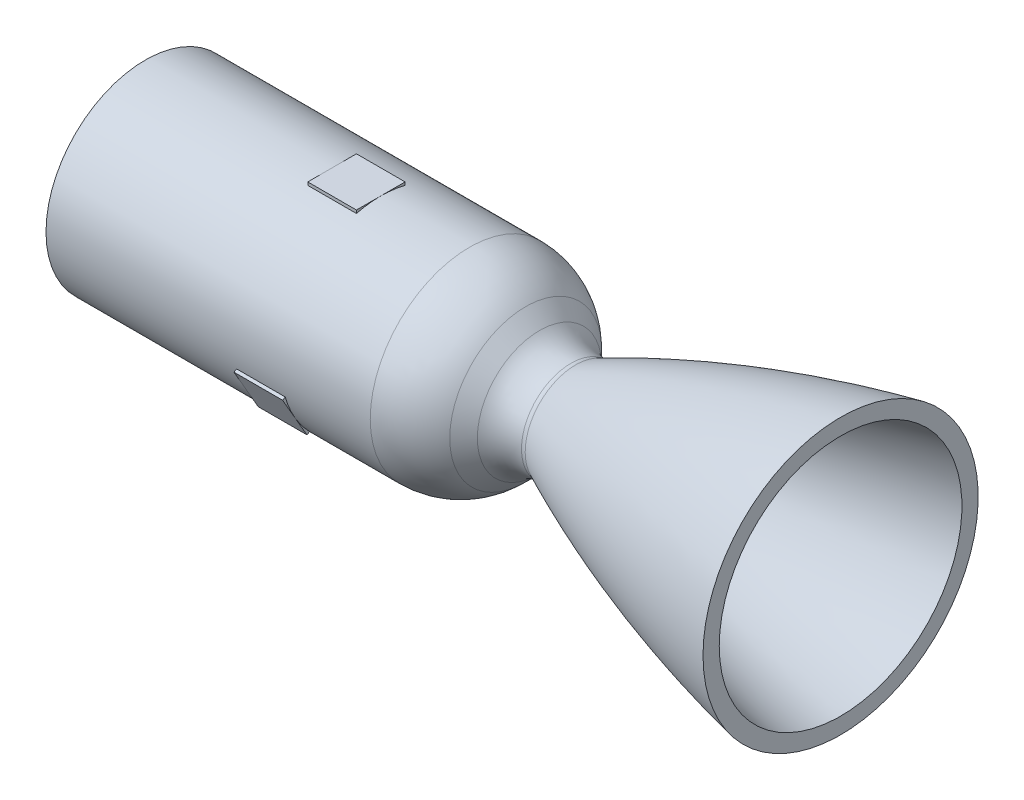
ISO-10303-21;
HEADER;
FILE_DESCRIPTION(('STEP AP214'),'2;1');
FILE_NAME('part.step','',(''),(''),'','','');
FILE_SCHEMA(('AUTOMOTIVE_DESIGN { 1 0 10303 214 1 1 1 1 }'));
ENDSEC;
DATA;
#1=APPLICATION_CONTEXT('core data for automotive mechanical design processes');
#2=APPLICATION_PROTOCOL_DEFINITION('international standard','automotive_design',2000,#1);
#3=PRODUCT_CONTEXT('',#1,'mechanical');
#4=PRODUCT('Part','Part','',(#3));
#5=PRODUCT_RELATED_PRODUCT_CATEGORY('part','',(#4));
#6=PRODUCT_DEFINITION_FORMATION('','',#4);
#7=PRODUCT_DEFINITION_CONTEXT('part definition',#1,'design');
#8=PRODUCT_DEFINITION('design','',#6,#7);
#9=PRODUCT_DEFINITION_SHAPE('','',#8);
#10=(LENGTH_UNIT() NAMED_UNIT(*) SI_UNIT(.MILLI.,.METRE.));
#11=(NAMED_UNIT(*) PLANE_ANGLE_UNIT() SI_UNIT($,.RADIAN.));
#12=(NAMED_UNIT(*) SI_UNIT($,.STERADIAN.) SOLID_ANGLE_UNIT());
#13=UNCERTAINTY_MEASURE_WITH_UNIT(LENGTH_MEASURE(1.E-05),#10,'distance_accuracy_value','');
#14=(GEOMETRIC_REPRESENTATION_CONTEXT(3) GLOBAL_UNCERTAINTY_ASSIGNED_CONTEXT((#13)) GLOBAL_UNIT_ASSIGNED_CONTEXT((#10,
#11,#12)) REPRESENTATION_CONTEXT('',''));
#15=CARTESIAN_POINT('',(0.,0.,0.));
#16=DIRECTION('',(0.,0.,1.));
#17=DIRECTION('',(1.,0.,0.));
#18=AXIS2_PLACEMENT_3D('',#15,#16,#17);
#19=CARTESIAN_POINT('',(-1.94875413684222,-13.3985,0.));
#20=DIRECTION('',(-1.,0.,0.));
#21=DIRECTION('',(0.,0.,1.));
#22=AXIS2_PLACEMENT_3D('',#19,#20,#21);
#23=TOROIDAL_SURFACE('',#22,30.2904023033658,17.30502);
#24=CARTESIAN_POINT('',(-1.86248370200098,-13.3985,0.));
#25=DIRECTION('',(-1.,0.,0.));
#26=DIRECTION('',(0.,0.,1.));
#27=AXIS2_PLACEMENT_3D('',#24,#25,#26);
#28=CIRCLE('',#27,12.985597346);
#29=CARTESIAN_POINT('',(-1.86248370200098,-13.3985,12.985597346));
#30=VERTEX_POINT('',#29);
#31=EDGE_CURVE('E308',#30,#30,#28,.T.);
#32=ORIENTED_EDGE('',*,*,#31,.F.);
#33=EDGE_LOOP('',(#32));
#34=FACE_BOUND('',#33,.T.);
#35=CARTESIAN_POINT('',(-14.1240966598112,-13.3985,0.));
#36=DIRECTION('',(-1.,0.,0.));
#37=DIRECTION('',(0.,0.,1.));
#38=AXIS2_PLACEMENT_3D('',#35,#36,#37);
#39=CIRCLE('',#38,17.9930549614069);
#40=CARTESIAN_POINT('',(-14.1240966598112,-13.3985,17.9930549614069));
#41=VERTEX_POINT('',#40);
#42=EDGE_CURVE('E11',#41,#41,#39,.T.);
#43=ORIENTED_EDGE('',*,*,#42,.T.);
#44=EDGE_LOOP('',(#43));
#45=FACE_BOUND('',#44,.T.);
#46=ADVANCED_FACE('F42',(#34,#45),#23,.T.);
#47=CARTESIAN_POINT('',(-19.5266187422485,-13.3985,0.));
#48=DIRECTION('',(-1.,0.,0.));
#49=DIRECTION('',(0.,0.,1.));
#50=AXIS2_PLACEMENT_3D('',#47,#48,#49);
#51=CONICAL_SURFACE('',#50,23.3955770438442,0.785398163397447);
#52=ORIENTED_EDGE('',*,*,#42,.F.);
#53=EDGE_LOOP('',(#52));
#54=FACE_BOUND('',#53,.T.);
#55=CARTESIAN_POINT('',(-19.5266187422485,-13.3985,0.));
#56=DIRECTION('',(-1.,0.,0.));
#57=DIRECTION('',(0.,0.,1.));
#58=AXIS2_PLACEMENT_3D('',#55,#56,#57);
#59=CIRCLE('',#58,23.3955770438442);
#60=CARTESIAN_POINT('',(-19.5266187422485,-13.3985,23.3955770438442));
#61=VERTEX_POINT('',#60);
#62=EDGE_CURVE('E49',#61,#61,#59,.T.);
#63=ORIENTED_EDGE('',*,*,#62,.T.);
#64=EDGE_LOOP('',(#63));
#65=FACE_BOUND('',#64,.T.);
#66=ADVANCED_FACE('F371',(#54,#65),#51,.F.);
#67=CARTESIAN_POINT('',(-41.5336343925406,-13.3985,0.));
#68=DIRECTION('',(-1.,0.,0.));
#69=DIRECTION('',(0.,0.,1.));
#70=AXIS2_PLACEMENT_3D('',#67,#68,#69);
#71=DEGENERATE_TOROIDAL_SURFACE('',#70,1.3885613935522,31.12262,.T.);
#72=ORIENTED_EDGE('',*,*,#62,.F.);
#73=EDGE_LOOP('',(#72));
#74=FACE_BOUND('',#73,.T.);
#75=CARTESIAN_POINT('',(-41.5336343925407,-13.3985,0.));
#76=DIRECTION('',(-1.,0.,0.));
#77=DIRECTION('',(0.,0.,1.));
#78=AXIS2_PLACEMENT_3D('',#75,#76,#77);
#79=CIRCLE('',#78,32.5111813935522);
#80=CARTESIAN_POINT('',(-41.5336343925407,-13.3985,32.5111813935522));
#81=VERTEX_POINT('',#80);
#82=EDGE_CURVE('E384',#81,#81,#79,.T.);
#83=ORIENTED_EDGE('',*,*,#82,.T.);
#84=EDGE_LOOP('',(#83));
#85=FACE_BOUND('',#84,.T.);
#86=ADVANCED_FACE('F368',(#74,#85),#71,.F.);
#87=CARTESIAN_POINT('',(-168.447274484,-13.3985,0.));
#88=DIRECTION('',(-1.,0.,0.));
#89=DIRECTION('',(0.,0.,1.));
#90=AXIS2_PLACEMENT_3D('',#87,#88,#89);
#91=CYLINDRICAL_SURFACE('',#90,32.5111813935522);
#92=ORIENTED_EDGE('',*,*,#82,.F.);
#93=EDGE_LOOP('',(#92));
#94=FACE_BOUND('',#93,.T.);
#95=CARTESIAN_POINT('',(-168.447274392541,-13.3985,0.));
#96=DIRECTION('',(-1.,0.,0.));
#97=DIRECTION('',(0.,0.,1.));
#98=AXIS2_PLACEMENT_3D('',#95,#96,#97);
#99=CIRCLE('',#98,32.5111813935522);
#100=CARTESIAN_POINT('',(-168.447274392541,-13.3985,32.5111813935522));
#101=VERTEX_POINT('',#100);
#102=EDGE_CURVE('E387',#101,#101,#99,.T.);
#103=ORIENTED_EDGE('',*,*,#102,.T.);
#104=EDGE_LOOP('',(#103));
#105=FACE_BOUND('',#104,.T.);
#106=ADVANCED_FACE('F364',(#94,#105),#91,.F.);
#107=CARTESIAN_POINT('',(-168.447274392541,25.4626813937186,0.));
#108=DIRECTION('',(1.,0.,0.));
#109=DIRECTION('',(0.,0.,-1.));
#110=AXIS2_PLACEMENT_3D('',#107,#108,#109);
#111=PLANE('',#110);
#112=ORIENTED_EDGE('',*,*,#102,.F.);
#113=EDGE_LOOP('',(#112));
#114=FACE_BOUND('',#113,.T.);
#115=CARTESIAN_POINT('',(-168.447274392541,-13.3985,0.));
#116=DIRECTION('',(-1.,0.,0.));
#117=DIRECTION('',(0.,0.,1.));
#118=AXIS2_PLACEMENT_3D('',#115,#116,#117);
#119=CIRCLE('',#118,38.8611813937186);
#120=CARTESIAN_POINT('',(-168.447274392541,-13.3985,38.8611813937186));
#121=VERTEX_POINT('',#120);
#122=EDGE_CURVE('E392',#121,#121,#119,.T.);
#123=ORIENTED_EDGE('',*,*,#122,.T.);
#124=EDGE_LOOP('',(#123));
#125=FACE_BOUND('',#124,.T.);
#126=ADVANCED_FACE('F361',(#114,#125),#111,.F.);
#127=CARTESIAN_POINT('',(-168.447274484,-13.3985,0.));
#128=DIRECTION('',(-1.,0.,0.));
#129=DIRECTION('',(0.,0.,1.));
#130=AXIS2_PLACEMENT_3D('',#127,#128,#129);
#131=CYLINDRICAL_SURFACE('',#130,38.8611813937186);
#132=DIRECTION('',(-1.,0.,0.));
#133=VECTOR('',#132,1.);
#134=CARTESIAN_POINT('',(-168.447274484,-23.9875072902279,37.3906986284424));
#135=LINE('',#134,#133);
#136=CARTESIAN_POINT('',(-76.2742871149733,-23.9875072902279,37.3906986284424));
#137=VERTEX_POINT('',#136);
#138=CARTESIAN_POINT('',(-95.3242871149733,-23.9875072902279,37.3906986284424));
#139=VERTEX_POINT('',#138);
#140=EDGE_CURVE('E58',#137,#139,#135,.T.);
#141=ORIENTED_EDGE('',*,*,#140,.F.);
#142=CARTESIAN_POINT('',(-76.2742871149733,-13.3985,0.));
#143=DIRECTION('',(1.,0.,0.));
#144=DIRECTION('',(0.,0.,-1.));
#145=AXIS2_PLACEMENT_3D('',#142,#143,#144);
#146=CIRCLE('',#145,38.8611813937186);
#147=CARTESIAN_POINT('',(-76.2742871149733,-32.829090696859,33.6547703080357));
#148=VERTEX_POINT('',#147);
#149=EDGE_CURVE('E181',#148,#137,#146,.F.);
#150=ORIENTED_EDGE('',*,*,#149,.F.);
#151=CARTESIAN_POINT('',(-76.2742871149733,-13.3985,0.));
#152=DIRECTION('',(1.,0.,0.));
#153=DIRECTION('',(0.,0.,-1.));
#154=AXIS2_PLACEMENT_3D('',#151,#152,#153);
#155=CIRCLE('',#154,38.8611813937186);
#156=CARTESIAN_POINT('',(-76.2742871149733,-40.4852912323226,27.8656986284585));
#157=VERTEX_POINT('',#156);
#158=EDGE_CURVE('E174',#157,#148,#155,.F.);
#159=ORIENTED_EDGE('',*,*,#158,.F.);
#160=DIRECTION('',(-1.,0.,0.));
#161=VECTOR('',#160,1.);
#162=CARTESIAN_POINT('',(-168.447274484,-40.4852912323226,27.8656986284585));
#163=LINE('',#162,#161);
#164=CARTESIAN_POINT('',(-95.3242871149733,-40.4852912323808,27.865698628402));
#165=VERTEX_POINT('',#164);
#166=EDGE_CURVE('E179',#165,#157,#163,.F.);
#167=ORIENTED_EDGE('',*,*,#166,.F.);
#168=CARTESIAN_POINT('',(-95.3242871149733,-13.3985,0.));
#169=DIRECTION('',(-1.,0.,0.));
#170=DIRECTION('',(0.,0.,1.));
#171=AXIS2_PLACEMENT_3D('',#168,#169,#170);
#172=CIRCLE('',#171,38.8611813937186);
#173=CARTESIAN_POINT('',(-95.3242871149733,-32.829090696859,33.6547703080357));
#174=VERTEX_POINT('',#173);
#175=EDGE_CURVE('E197',#174,#165,#172,.F.);
#176=ORIENTED_EDGE('',*,*,#175,.F.);
#177=CARTESIAN_POINT('',(-95.3242871149733,-13.3985,0.));
#178=DIRECTION('',(-1.,0.,0.));
#179=DIRECTION('',(0.,0.,1.));
#180=AXIS2_PLACEMENT_3D('',#177,#178,#179);
#181=CIRCLE('',#180,38.8611813937186);
#182=EDGE_CURVE('E66',#139,#174,#181,.F.);
#183=ORIENTED_EDGE('',*,*,#182,.F.);
#184=EDGE_LOOP('',(#141,#150,#159,#167,#176,#183));
#185=FACE_BOUND('',#184,.T.);
#186=DIRECTION('',(-1.,0.,0.));
#187=VECTOR('',#186,1.);
#188=CARTESIAN_POINT('',(-168.447274484,-40.485291232323,-27.8656986284582));
#189=LINE('',#188,#187);
#190=CARTESIAN_POINT('',(-76.2742871149733,-40.485291232323,-27.8656986284582));
#191=VERTEX_POINT('',#190);
#192=CARTESIAN_POINT('',(-95.3242871149733,-40.485291232323,-27.8656986284582));
#193=VERTEX_POINT('',#192);
#194=EDGE_CURVE('E217',#191,#193,#189,.T.);
#195=ORIENTED_EDGE('',*,*,#194,.F.);
#196=CARTESIAN_POINT('',(-76.2742871149733,-13.3985,0.));
#197=DIRECTION('',(1.,0.,0.));
#198=DIRECTION('',(0.,0.,-1.));
#199=AXIS2_PLACEMENT_3D('',#196,#197,#198);
#200=CIRCLE('',#199,38.8611813937186);
#201=CARTESIAN_POINT('',(-76.2742871149733,-32.8290906968595,-33.6547703080354));
#202=VERTEX_POINT('',#201);
#203=EDGE_CURVE('E243',#202,#191,#200,.F.);
#204=ORIENTED_EDGE('',*,*,#203,.F.);
#205=CARTESIAN_POINT('',(-76.2742871149733,-13.3985,0.));
#206=DIRECTION('',(1.,0.,0.));
#207=DIRECTION('',(0.,0.,-1.));
#208=AXIS2_PLACEMENT_3D('',#205,#206,#207);
#209=CIRCLE('',#208,38.8611813937186);
#210=CARTESIAN_POINT('',(-76.2742871149733,-23.9875072902284,-37.3906986284422));
#211=VERTEX_POINT('',#210);
#212=EDGE_CURVE('E261',#211,#202,#209,.F.);
#213=ORIENTED_EDGE('',*,*,#212,.F.);
#214=DIRECTION('',(-1.,0.,0.));
#215=VECTOR('',#214,1.);
#216=CARTESIAN_POINT('',(-168.447274484,-23.9875072902284,-37.3906986284422));
#217=LINE('',#216,#215);
#218=CARTESIAN_POINT('',(-95.3242871149733,-23.9875072901461,-37.3906986284656));
#219=VERTEX_POINT('',#218);
#220=EDGE_CURVE('E257',#219,#211,#217,.F.);
#221=ORIENTED_EDGE('',*,*,#220,.F.);
#222=CARTESIAN_POINT('',(-95.3242871149733,-13.3985,0.));
#223=DIRECTION('',(-1.,0.,0.));
#224=DIRECTION('',(0.,0.,1.));
#225=AXIS2_PLACEMENT_3D('',#222,#223,#224);
#226=CIRCLE('',#225,38.8611813937186);
#227=CARTESIAN_POINT('',(-95.3242871149733,-32.8290906968595,-33.6547703080354));
#228=VERTEX_POINT('',#227);
#229=EDGE_CURVE('E227',#228,#219,#226,.F.);
#230=ORIENTED_EDGE('',*,*,#229,.F.);
#231=CARTESIAN_POINT('',(-95.3242871149733,-13.3985,0.));
#232=DIRECTION('',(-1.,0.,0.));
#233=DIRECTION('',(0.,0.,1.));
#234=AXIS2_PLACEMENT_3D('',#231,#232,#233);
#235=CIRCLE('',#234,38.8611813937186);
#236=EDGE_CURVE('E235',#193,#228,#235,.F.);
#237=ORIENTED_EDGE('',*,*,#236,.F.);
#238=EDGE_LOOP('',(#195,#204,#213,#221,#230,#237));
#239=FACE_BOUND('',#238,.T.);
#240=DIRECTION('',(-1.,0.,0.));
#241=VECTOR('',#240,1.);
#242=CARTESIAN_POINT('',(-168.447274484,24.2772985225994,-9.52499999999995));
#243=LINE('',#242,#241);
#244=CARTESIAN_POINT('',(-76.2742871149733,24.2772985225994,-9.52499999999995));
#245=VERTEX_POINT('',#244);
#246=CARTESIAN_POINT('',(-95.3242871149733,24.2772985225994,-9.52499999999997));
#247=VERTEX_POINT('',#246);
#248=EDGE_CURVE('E268',#245,#247,#243,.T.);
#249=ORIENTED_EDGE('',*,*,#248,.F.);
#250=CARTESIAN_POINT('',(-76.2742871149733,-13.3985,0.));
#251=DIRECTION('',(1.,0.,0.));
#252=DIRECTION('',(0.,0.,-1.));
#253=AXIS2_PLACEMENT_3D('',#250,#251,#252);
#254=CIRCLE('',#253,38.8611813937186);
#255=CARTESIAN_POINT('',(-76.2742871149733,25.4626813937186,0.));
#256=VERTEX_POINT('',#255);
#257=EDGE_CURVE('E288',#256,#245,#254,.F.);
#258=ORIENTED_EDGE('',*,*,#257,.F.);
#259=CARTESIAN_POINT('',(-76.2742871149733,-13.3985,0.));
#260=DIRECTION('',(1.,0.,0.));
#261=DIRECTION('',(0.,0.,-1.));
#262=AXIS2_PLACEMENT_3D('',#259,#260,#261);
#263=CIRCLE('',#262,38.8611813937186);
#264=CARTESIAN_POINT('',(-76.2742871149733,24.2772985225994,9.52500000000005));
#265=VERTEX_POINT('',#264);
#266=EDGE_CURVE('E305',#265,#256,#263,.F.);
#267=ORIENTED_EDGE('',*,*,#266,.F.);
#268=DIRECTION('',(-1.,0.,0.));
#269=VECTOR('',#268,1.);
#270=CARTESIAN_POINT('',(-168.447274484,24.2772985225994,9.52500000000005));
#271=LINE('',#270,#269);
#272=CARTESIAN_POINT('',(-95.3242871149733,24.2772985225912,9.52500000003237));
#273=VERTEX_POINT('',#272);
#274=EDGE_CURVE('E302',#273,#265,#271,.F.);
#275=ORIENTED_EDGE('',*,*,#274,.F.);
#276=CARTESIAN_POINT('',(-95.3242871149733,-13.3985,0.));
#277=DIRECTION('',(-1.,0.,0.));
#278=DIRECTION('',(0.,0.,1.));
#279=AXIS2_PLACEMENT_3D('',#276,#277,#278);
#280=CIRCLE('',#279,38.8611813937186);
#281=CARTESIAN_POINT('',(-95.3242871149733,25.4626813937186,0.));
#282=VERTEX_POINT('',#281);
#283=EDGE_CURVE('E276',#282,#273,#280,.F.);
#284=ORIENTED_EDGE('',*,*,#283,.F.);
#285=CARTESIAN_POINT('',(-95.3242871149733,-13.3985,0.));
#286=DIRECTION('',(-1.,0.,0.));
#287=DIRECTION('',(0.,0.,1.));
#288=AXIS2_PLACEMENT_3D('',#285,#286,#287);
#289=CIRCLE('',#288,38.8611813937186);
#290=EDGE_CURVE('E284',#247,#282,#289,.F.);
#291=ORIENTED_EDGE('',*,*,#290,.F.);
#292=EDGE_LOOP('',(#249,#258,#267,#275,#284,#291));
#293=FACE_BOUND('',#292,.T.);
#294=ORIENTED_EDGE('',*,*,#122,.F.);
#295=EDGE_LOOP('',(#294));
#296=FACE_BOUND('',#295,.T.);
#297=CARTESIAN_POINT('',(-41.5336343917516,-13.3985,0.));
#298=DIRECTION('',(-1.,0.,0.));
#299=DIRECTION('',(0.,0.,1.));
#300=AXIS2_PLACEMENT_3D('',#297,#298,#299);
#301=CIRCLE('',#300,38.8611813937186);
#302=CARTESIAN_POINT('',(-41.5336343917516,-13.3985,38.8611813937186));
#303=VERTEX_POINT('',#302);
#304=EDGE_CURVE('E395',#303,#303,#301,.T.);
#305=ORIENTED_EDGE('',*,*,#304,.T.);
#306=EDGE_LOOP('',(#305));
#307=FACE_BOUND('',#306,.T.);
#308=ADVANCED_FACE('F182',(#185,#239,#293,#296,#307),#131,.T.);
#309=CARTESIAN_POINT('',(-41.5336343917516,-13.3985,0.));
#310=DIRECTION('',(-1.,0.,0.));
#311=DIRECTION('',(0.,0.,1.));
#312=AXIS2_PLACEMENT_3D('',#309,#310,#311);
#313=DEGENERATE_TOROIDAL_SURFACE('',#312,7.7385613937186,31.12262,.T.);
#314=ORIENTED_EDGE('',*,*,#304,.F.);
#315=EDGE_LOOP('',(#314));
#316=FACE_BOUND('',#315,.T.);
#317=CARTESIAN_POINT('',(-19.5266187414596,-13.3985,0.));
#318=DIRECTION('',(-1.,0.,0.));
#319=DIRECTION('',(0.,0.,1.));
#320=AXIS2_PLACEMENT_3D('',#317,#318,#319);
#321=CIRCLE('',#320,29.7455770440107);
#322=CARTESIAN_POINT('',(-19.5266187414596,-13.3985,29.7455770440107));
#323=VERTEX_POINT('',#322);
#324=EDGE_CURVE('E398',#323,#323,#321,.T.);
#325=ORIENTED_EDGE('',*,*,#324,.T.);
#326=EDGE_LOOP('',(#325));
#327=FACE_BOUND('',#326,.T.);
#328=ADVANCED_FACE('F354',(#316,#327),#313,.T.);
#329=CARTESIAN_POINT('',(-14.1240966590173,-13.3985,0.));
#330=DIRECTION('',(-1.,0.,0.));
#331=DIRECTION('',(0.,0.,1.));
#332=AXIS2_PLACEMENT_3D('',#329,#330,#331);
#333=CONICAL_SURFACE('',#332,24.3430549615684,0.785398163397449);
#334=ORIENTED_EDGE('',*,*,#324,.F.);
#335=EDGE_LOOP('',(#334));
#336=FACE_BOUND('',#335,.T.);
#337=CARTESIAN_POINT('',(-14.1240966590173,-13.3985,0.));
#338=DIRECTION('',(-1.,0.,0.));
#339=DIRECTION('',(0.,0.,1.));
#340=AXIS2_PLACEMENT_3D('',#337,#338,#339);
#341=CIRCLE('',#340,24.3430549615684);
#342=CARTESIAN_POINT('',(-14.1240966590173,-13.3985,24.3430549615684));
#343=VERTEX_POINT('',#342);
#344=EDGE_CURVE('E402',#343,#343,#341,.T.);
#345=ORIENTED_EDGE('',*,*,#344,.T.);
#346=EDGE_LOOP('',(#345));
#347=FACE_BOUND('',#346,.T.);
#348=ADVANCED_FACE('F350',(#336,#347),#333,.T.);
#349=CARTESIAN_POINT('',(-1.94875413605325,-13.3985,0.));
#350=DIRECTION('',(-1.,0.,0.));
#351=DIRECTION('',(0.,0.,1.));
#352=AXIS2_PLACEMENT_3D('',#349,#350,#351);
#353=TOROIDAL_SURFACE('',#352,36.6404023035322,17.30502);
#354=ORIENTED_EDGE('',*,*,#344,.F.);
#355=EDGE_LOOP('',(#354));
#356=FACE_BOUND('',#355,.T.);
#357=CARTESIAN_POINT('',(-1.862483701211,-13.3985,0.));
#358=DIRECTION('',(-1.,0.,0.));
#359=DIRECTION('',(0.,0.,1.));
#360=AXIS2_PLACEMENT_3D('',#357,#358,#359);
#361=CIRCLE('',#360,19.3355973461664);
#362=CARTESIAN_POINT('',(-1.862483701211,-13.3985,19.3355973461664));
#363=VERTEX_POINT('',#362);
#364=EDGE_CURVE('E405',#363,#363,#361,.T.);
#365=ORIENTED_EDGE('',*,*,#364,.T.);
#366=EDGE_LOOP('',(#365));
#367=FACE_BOUND('',#366,.T.);
#368=ADVANCED_FACE('F346',(#356,#367),#353,.F.);
#369=CARTESIAN_POINT('',(-1.86248370121102,-13.3985,0.));
#370=DIRECTION('',(-1.,0.,0.));
#371=DIRECTION('',(0.,0.,1.));
#372=AXIS2_PLACEMENT_3D('',#369,#370,#371);
#373=TOROIDAL_SURFACE('',#372,23.7426091061664,4.40701176000001);
#374=ORIENTED_EDGE('',*,*,#364,.F.);
#375=EDGE_LOOP('',(#374));
#376=FACE_BOUND('',#375,.T.);
#377=CARTESIAN_POINT('',(-5.17484666229251E-08,-13.3985,0.));
#378=DIRECTION('',(-1.,0.,0.));
#379=DIRECTION('',(0.,0.,1.));
#380=AXIS2_PLACEMENT_3D('',#377,#378,#379);
#381=CIRCLE('',#380,19.7485000305073);
#382=CARTESIAN_POINT('',(-5.17484666229251E-08,-13.3985,19.7485000305073));
#383=VERTEX_POINT('',#382);
#384=EDGE_CURVE('E408',#383,#383,#381,.T.);
#385=ORIENTED_EDGE('',*,*,#384,.T.);
#386=EDGE_LOOP('',(#385));
#387=FACE_BOUND('',#386,.T.);
#388=ADVANCED_FACE('F342',(#376,#387),#373,.F.);
#389=CARTESIAN_POINT('',(103.705659961385,40.4514191372172,0.));
#390=CARTESIAN_POINT('',(86.4213832925295,36.8435756859968,0.));
#391=CARTESIAN_POINT('',(69.1371066236739,32.5070057948643,0.));
#392=CARTESIAN_POINT('',(51.8528299548183,27.3770151965228,0.));
#393=CARTESIAN_POINT('',(34.5685532859628,21.3761973155407,0.));
#394=CARTESIAN_POINT('',(17.2842766171072,14.4093379011269,0.));
#395=CARTESIAN_POINT('',(-5.17484614187547E-08,6.35000003050726,0.));
#396=B_SPLINE_CURVE_WITH_KNOTS('',6,(#389,#390,#391,#392,#393,#394,#395),.UNSPECIFIED.,.F.,.F.,
(7,7),(0.0794904389100287,0.91631731272735),.UNSPECIFIED.);
#397=CARTESIAN_POINT('',(-168.447274484,-13.3985,0.));
#398=DIRECTION('',(-1.,0.,0.));
#399=AXIS1_PLACEMENT('',#397,#398);
#400=SURFACE_OF_REVOLUTION('',#396,#399);
#401=ORIENTED_EDGE('',*,*,#384,.F.);
#402=EDGE_LOOP('',(#401));
#403=FACE_BOUND('',#402,.T.);
#404=CARTESIAN_POINT('',(103.70565996178,-13.3985,0.));
#405=DIRECTION('',(-1.,0.,0.));
#406=DIRECTION('',(0.,0.,1.));
#407=AXIS2_PLACEMENT_3D('',#404,#405,#406);
#408=CIRCLE('',#407,53.8499191372996);
#409=CARTESIAN_POINT('',(103.70565996178,-13.3985,53.8499191372996));
#410=VERTEX_POINT('',#409);
#411=EDGE_CURVE('E411',#410,#410,#408,.T.);
#412=ORIENTED_EDGE('',*,*,#411,.T.);
#413=EDGE_LOOP('',(#412));
#414=FACE_BOUND('',#413,.T.);
#415=ADVANCED_FACE('F338',(#403,#414),#400,.T.);
#416=CARTESIAN_POINT('',(103.705659961582,34.1014191372996,0.));
#417=DIRECTION('',(-1.,0.,0.));
#418=DIRECTION('',(0.,0.,1.));
#419=AXIS2_PLACEMENT_3D('',#416,#417,#418);
#420=PLANE('',#419);
#421=ORIENTED_EDGE('',*,*,#411,.F.);
#422=EDGE_LOOP('',(#421));
#423=FACE_BOUND('',#422,.T.);
#424=CARTESIAN_POINT('',(103.705659961385,-13.3985,0.));
#425=DIRECTION('',(-1.,0.,0.));
#426=DIRECTION('',(0.,0.,1.));
#427=AXIS2_PLACEMENT_3D('',#424,#425,#426);
#428=CIRCLE('',#427,47.4999191372172);
#429=CARTESIAN_POINT('',(103.705659961385,-13.3985,47.4999191372172));
#430=VERTEX_POINT('',#429);
#431=EDGE_CURVE('E414',#430,#430,#428,.T.);
#432=ORIENTED_EDGE('',*,*,#431,.T.);
#433=EDGE_LOOP('',(#432));
#434=FACE_BOUND('',#433,.T.);
#435=ADVANCED_FACE('F333',(#423,#434),#420,.F.);
#436=CARTESIAN_POINT('',(-5.25244559217847E-08,3.0346890039952E-08,0.));
#437=CARTESIAN_POINT('',(17.2842766164605,8.0593379010264,0.));
#438=CARTESIAN_POINT('',(34.5685532854454,15.026197315484,0.));
#439=CARTESIAN_POINT('',(51.8528299544303,21.0270151964967,0.));
#440=CARTESIAN_POINT('',(69.1371066234153,26.1570057948568,0.));
#441=CARTESIAN_POINT('',(86.4213832924002,30.4935756859974,0.));
#442=CARTESIAN_POINT('',(103.705659961385,34.1014191372172,0.));
#443=B_SPLINE_CURVE_WITH_KNOTS('',6,(#436,#437,#438,#439,#440,#441,#442),.UNSPECIFIED.,.F.,.F.,
(7,7),(0.079490438910028,0.916317312733607),.UNSPECIFIED.);
#444=CARTESIAN_POINT('',(-168.447274484,-13.3985,0.));
#445=DIRECTION('',(-1.,0.,0.));
#446=AXIS1_PLACEMENT('',#444,#445);
#447=SURFACE_OF_REVOLUTION('',#443,#446);
#448=ORIENTED_EDGE('',*,*,#431,.F.);
#449=EDGE_LOOP('',(#448));
#450=FACE_BOUND('',#449,.T.);
#451=CARTESIAN_POINT('',(-5.25179622012928E-08,-13.3985,0.));
#452=DIRECTION('',(-1.,0.,0.));
#453=DIRECTION('',(0.,0.,1.));
#454=AXIS2_PLACEMENT_3D('',#451,#452,#453);
#455=CIRCLE('',#454,13.3985000303499);
#456=CARTESIAN_POINT('',(-5.25179622012928E-08,-13.3985,13.3985000303499));
#457=VERTEX_POINT('',#456);
#458=EDGE_CURVE('E417',#457,#457,#455,.T.);
#459=ORIENTED_EDGE('',*,*,#458,.T.);
#460=EDGE_LOOP('',(#459));
#461=FACE_BOUND('',#460,.T.);
#462=ADVANCED_FACE('F328',(#450,#461),#447,.T.);
#463=CARTESIAN_POINT('',(-1.862483702,-13.3985,0.));
#464=DIRECTION('',(-1.,0.,0.));
#465=DIRECTION('',(0.,0.,1.));
#466=AXIS2_PLACEMENT_3D('',#463,#464,#465);
#467=TOROIDAL_SURFACE('',#466,17.392609106,4.40701176);
#468=ORIENTED_EDGE('',*,*,#458,.F.);
#469=EDGE_LOOP('',(#468));
#470=FACE_BOUND('',#469,.T.);
#471=ORIENTED_EDGE('',*,*,#31,.T.);
#472=EDGE_LOOP('',(#471));
#473=FACE_BOUND('',#472,.T.);
#474=ADVANCED_FACE('F332',(#470,#473),#467,.T.);
#475=CARTESIAN_POINT('',(-76.2742871149733,-500000.,-9.52499999999998));
#476=DIRECTION('',(1.,0.,0.));
#477=DIRECTION('',(0.,0.,-1.));
#478=AXIS2_PLACEMENT_3D('',#475,#476,#477);
#479=PLANE('',#478);
#480=DIRECTION('',(0.,1.,0.));
#481=VECTOR('',#480,1.);
#482=CARTESIAN_POINT('',(-76.2742871149733,-500000.,9.52500000000002));
#483=LINE('',#482,#481);
#484=CARTESIAN_POINT('',(-76.2742871149733,25.4626813937186,9.52500000000002));
#485=VERTEX_POINT('',#484);
#486=EDGE_CURVE('E298',#265,#485,#483,.T.);
#487=ORIENTED_EDGE('',*,*,#486,.F.);
#488=ORIENTED_EDGE('',*,*,#266,.T.);
#489=DIRECTION('',(0.,0.,-1.));
#490=VECTOR('',#489,1.);
#491=CARTESIAN_POINT('',(-76.2742871149733,25.4626813937186,-9.52499999999998));
#492=LINE('',#491,#490);
#493=EDGE_CURVE('E295',#485,#256,#492,.T.);
#494=ORIENTED_EDGE('',*,*,#493,.F.);
#495=EDGE_LOOP('',(#487,#488,#494));
#496=FACE_BOUND('',#495,.T.);
#497=ADVANCED_FACE('F424',(#496),#479,.T.);
#498=CARTESIAN_POINT('',(-76.2742871149733,-500000.,9.52500000000002));
#499=DIRECTION('',(0.,0.,1.));
#500=DIRECTION('',(1.,0.,0.));
#501=AXIS2_PLACEMENT_3D('',#498,#499,#500);
#502=PLANE('',#501);
#503=DIRECTION('',(0.,1.,0.));
#504=VECTOR('',#503,1.);
#505=CARTESIAN_POINT('',(-95.3242871149733,-500000.,9.52500000000003));
#506=LINE('',#505,#504);
#507=CARTESIAN_POINT('',(-95.3242871149733,25.4626813937186,9.52500000000003));
#508=VERTEX_POINT('',#507);
#509=EDGE_CURVE('E310',#273,#508,#506,.T.);
#510=ORIENTED_EDGE('',*,*,#509,.F.);
#511=ORIENTED_EDGE('',*,*,#274,.T.);
#512=ORIENTED_EDGE('',*,*,#486,.T.);
#513=DIRECTION('',(1.,0.,0.));
#514=VECTOR('',#513,1.);
#515=CARTESIAN_POINT('',(-76.2742871149733,25.4626813937186,9.52500000000002));
#516=LINE('',#515,#514);
#517=EDGE_CURVE('E297',#508,#485,#516,.T.);
#518=ORIENTED_EDGE('',*,*,#517,.F.);
#519=EDGE_LOOP('',(#510,#511,#512,#518));
#520=FACE_BOUND('',#519,.T.);
#521=ADVANCED_FACE('F430',(#520),#502,.T.);
#522=CARTESIAN_POINT('',(-95.3242871149733,-500000.,-9.52499999999997));
#523=DIRECTION('',(-1.,0.,0.));
#524=DIRECTION('',(0.,0.,1.));
#525=AXIS2_PLACEMENT_3D('',#522,#523,#524);
#526=PLANE('',#525);
#527=DIRECTION('',(0.,0.,1.));
#528=VECTOR('',#527,1.);
#529=CARTESIAN_POINT('',(-95.3242871149733,25.4626813937186,-9.52499999999997));
#530=LINE('',#529,#528);
#531=EDGE_CURVE('E301',#282,#508,#530,.T.);
#532=ORIENTED_EDGE('',*,*,#531,.F.);
#533=ORIENTED_EDGE('',*,*,#283,.T.);
#534=ORIENTED_EDGE('',*,*,#509,.T.);
#535=EDGE_LOOP('',(#532,#533,#534));
#536=FACE_BOUND('',#535,.T.);
#537=ADVANCED_FACE('F437',(#536),#526,.T.);
#538=CARTESIAN_POINT('',(0.,25.4626813937186,0.));
#539=DIRECTION('',(0.,-1.,0.));
#540=DIRECTION('',(0.,0.,-1.));
#541=AXIS2_PLACEMENT_3D('',#538,#539,#540);
#542=PLANE('',#541);
#543=ORIENTED_EDGE('',*,*,#493,.T.);
#544=DIRECTION('',(0.,0.,-1.));
#545=VECTOR('',#544,1.);
#546=CARTESIAN_POINT('',(-76.2742871149733,25.4626813937186,-9.52499999999998));
#547=LINE('',#546,#545);
#548=CARTESIAN_POINT('',(-76.2742871149733,25.4626813937186,-9.52499999999998));
#549=VERTEX_POINT('',#548);
#550=EDGE_CURVE('E277',#256,#549,#547,.T.);
#551=ORIENTED_EDGE('',*,*,#550,.T.);
#552=DIRECTION('',(-1.,0.,0.));
#553=VECTOR('',#552,1.);
#554=CARTESIAN_POINT('',(-76.2742871149733,25.4626813937186,-9.52499999999998));
#555=LINE('',#554,#553);
#556=CARTESIAN_POINT('',(-95.3242871149733,25.4626813937186,-9.52499999999997));
#557=VERTEX_POINT('',#556);
#558=EDGE_CURVE('E273',#549,#557,#555,.T.);
#559=ORIENTED_EDGE('',*,*,#558,.T.);
#560=DIRECTION('',(0.,0.,1.));
#561=VECTOR('',#560,1.);
#562=CARTESIAN_POINT('',(-95.3242871149733,25.4626813937186,-9.52499999999997));
#563=LINE('',#562,#561);
#564=EDGE_CURVE('E281',#557,#282,#563,.T.);
#565=ORIENTED_EDGE('',*,*,#564,.T.);
#566=ORIENTED_EDGE('',*,*,#531,.T.);
#567=ORIENTED_EDGE('',*,*,#517,.T.);
#568=EDGE_LOOP('',(#543,#551,#559,#565,#566,#567));
#569=FACE_BOUND('',#568,.T.);
#570=ADVANCED_FACE('F426',(#569),#542,.F.);
#571=CARTESIAN_POINT('',(-76.2742871149733,-500000.,-9.52499999999998));
#572=DIRECTION('',(0.,0.,-1.));
#573=DIRECTION('',(-1.,0.,0.));
#574=AXIS2_PLACEMENT_3D('',#571,#572,#573);
#575=PLANE('',#574);
#576=DIRECTION('',(0.,1.,0.));
#577=VECTOR('',#576,1.);
#578=CARTESIAN_POINT('',(-76.2742871149733,-500000.,-9.52499999999998));
#579=LINE('',#578,#577);
#580=EDGE_CURVE('E289',#245,#549,#579,.T.);
#581=ORIENTED_EDGE('',*,*,#580,.F.);
#582=ORIENTED_EDGE('',*,*,#248,.T.);
#583=DIRECTION('',(0.,1.,0.));
#584=VECTOR('',#583,1.);
#585=CARTESIAN_POINT('',(-95.3242871149733,-500000.,-9.52499999999997));
#586=LINE('',#585,#584);
#587=EDGE_CURVE('E280',#247,#557,#586,.T.);
#588=ORIENTED_EDGE('',*,*,#587,.T.);
#589=ORIENTED_EDGE('',*,*,#558,.F.);
#590=EDGE_LOOP('',(#581,#582,#588,#589));
#591=FACE_BOUND('',#590,.T.);
#592=ADVANCED_FACE('F436',(#591),#575,.T.);
#593=CARTESIAN_POINT('',(-76.2742871149733,-500000.,-9.52499999999998));
#594=DIRECTION('',(1.,0.,0.));
#595=DIRECTION('',(0.,0.,-1.));
#596=AXIS2_PLACEMENT_3D('',#593,#594,#595);
#597=PLANE('',#596);
#598=ORIENTED_EDGE('',*,*,#550,.F.);
#599=ORIENTED_EDGE('',*,*,#257,.T.);
#600=ORIENTED_EDGE('',*,*,#580,.T.);
#601=EDGE_LOOP('',(#598,#599,#600));
#602=FACE_BOUND('',#601,.T.);
#603=ADVANCED_FACE('F443',(#602),#597,.T.);
#604=CARTESIAN_POINT('',(-95.3242871149733,-500000.,-9.52499999999997));
#605=DIRECTION('',(-1.,0.,0.));
#606=DIRECTION('',(0.,0.,1.));
#607=AXIS2_PLACEMENT_3D('',#604,#605,#606);
#608=PLANE('',#607);
#609=ORIENTED_EDGE('',*,*,#587,.F.);
#610=ORIENTED_EDGE('',*,*,#290,.T.);
#611=ORIENTED_EDGE('',*,*,#564,.F.);
#612=EDGE_LOOP('',(#609,#610,#611));
#613=FACE_BOUND('',#612,.T.);
#614=ADVANCED_FACE('F433',(#613),#608,.T.);
#615=CARTESIAN_POINT('',(-76.2742871149733,288650.737572188,500000.));
#616=DIRECTION('',(1.,0.,0.));
#617=DIRECTION('',(0.,0.,-1.));
#618=AXIS2_PLACEMENT_3D('',#615,#616,#617);
#619=PLANE('',#618);
#620=DIRECTION('',(0.,-0.500000000000004,-0.866025403784436));
#621=VECTOR('',#620,1.);
#622=CARTESIAN_POINT('',(-76.2742871149733,288667.23535613,499990.475));
#623=LINE('',#622,#621);
#624=CARTESIAN_POINT('',(-76.2742871149733,-24.5801987258127,-38.4172703080354));
#625=VERTEX_POINT('',#624);
#626=EDGE_CURVE('E252',#211,#625,#623,.T.);
#627=ORIENTED_EDGE('',*,*,#626,.F.);
#628=ORIENTED_EDGE('',*,*,#212,.T.);
#629=DIRECTION('',(0.,-0.866025403784436,0.500000000000004));
#630=VECTOR('',#629,1.);
#631=CARTESIAN_POINT('',(-76.2742871149733,-41.0779826679062,-28.8922703080354));
#632=LINE('',#631,#630);
#633=EDGE_CURVE('E248',#625,#202,#632,.T.);
#634=ORIENTED_EDGE('',*,*,#633,.F.);
#635=EDGE_LOOP('',(#627,#628,#634));
#636=FACE_BOUND('',#635,.T.);
#637=ADVANCED_FACE('F455',(#636),#619,.T.);
#638=CARTESIAN_POINT('',(-76.2742871149733,288667.23535613,499990.475));
#639=DIRECTION('',(0.,0.866025403784436,-0.500000000000004));
#640=DIRECTION('',(0.,0.500000000000004,0.866025403784436));
#641=AXIS2_PLACEMENT_3D('',#638,#639,#640);
#642=PLANE('',#641);
#643=DIRECTION('',(0.,-0.500000000000004,-0.866025403784436));
#644=VECTOR('',#643,1.);
#645=CARTESIAN_POINT('',(-95.3242871149733,288667.23535613,499990.475));
#646=LINE('',#645,#644);
#647=CARTESIAN_POINT('',(-95.3242871149733,-24.5801987258127,-38.4172703080355));
#648=VERTEX_POINT('',#647);
#649=EDGE_CURVE('E265',#219,#648,#646,.T.);
#650=ORIENTED_EDGE('',*,*,#649,.F.);
#651=ORIENTED_EDGE('',*,*,#220,.T.);
#652=ORIENTED_EDGE('',*,*,#626,.T.);
#653=DIRECTION('',(1.,0.,0.));
#654=VECTOR('',#653,1.);
#655=CARTESIAN_POINT('',(-76.2742871149733,-24.5801987258127,-38.4172703080354));
#656=LINE('',#655,#654);
#657=EDGE_CURVE('E251',#648,#625,#656,.T.);
#658=ORIENTED_EDGE('',*,*,#657,.F.);
#659=EDGE_LOOP('',(#650,#651,#652,#658));
#660=FACE_BOUND('',#659,.T.);
#661=ADVANCED_FACE('F465',(#660),#642,.T.);
#662=CARTESIAN_POINT('',(-95.3242871149733,288650.737572188,500000.));
#663=DIRECTION('',(-1.,0.,0.));
#664=DIRECTION('',(0.,0.,1.));
#665=AXIS2_PLACEMENT_3D('',#662,#663,#664);
#666=PLANE('',#665);
#667=DIRECTION('',(0.,0.866025403784436,-0.500000000000004));
#668=VECTOR('',#667,1.);
#669=CARTESIAN_POINT('',(-95.3242871149733,-41.0779826679062,-28.8922703080354));
#670=LINE('',#669,#668);
#671=EDGE_CURVE('E256',#228,#648,#670,.T.);
#672=ORIENTED_EDGE('',*,*,#671,.F.);
#673=ORIENTED_EDGE('',*,*,#229,.T.);
#674=ORIENTED_EDGE('',*,*,#649,.T.);
#675=EDGE_LOOP('',(#672,#673,#674));
#676=FACE_BOUND('',#675,.T.);
#677=ADVANCED_FACE('F463',(#676),#666,.T.);
#678=CARTESIAN_POINT('',(0.,-32.8290906968595,-33.6547703080354));
#679=DIRECTION('',(0.,0.500000000000004,0.866025403784436));
#680=DIRECTION('',(0.,-0.866025403784436,0.500000000000004));
#681=AXIS2_PLACEMENT_3D('',#678,#679,#680);
#682=PLANE('',#681);
#683=ORIENTED_EDGE('',*,*,#633,.T.);
#684=DIRECTION('',(0.,-0.866025403784436,0.500000000000004));
#685=VECTOR('',#684,1.);
#686=CARTESIAN_POINT('',(-76.2742871149733,-41.0779826679062,-28.8922703080354));
#687=LINE('',#686,#685);
#688=CARTESIAN_POINT('',(-76.2742871149733,-41.0779826679062,-28.8922703080354));
#689=VERTEX_POINT('',#688);
#690=EDGE_CURVE('E228',#202,#689,#687,.T.);
#691=ORIENTED_EDGE('',*,*,#690,.T.);
#692=DIRECTION('',(-1.,0.,0.));
#693=VECTOR('',#692,1.);
#694=CARTESIAN_POINT('',(-76.2742871149733,-41.0779826679062,-28.8922703080354));
#695=LINE('',#694,#693);
#696=CARTESIAN_POINT('',(-95.3242871149733,-41.0779826679062,-28.8922703080354));
#697=VERTEX_POINT('',#696);
#698=EDGE_CURVE('E224',#689,#697,#695,.T.);
#699=ORIENTED_EDGE('',*,*,#698,.T.);
#700=DIRECTION('',(0.,0.866025403784436,-0.500000000000004));
#701=VECTOR('',#700,1.);
#702=CARTESIAN_POINT('',(-95.3242871149733,-41.0779826679062,-28.8922703080354));
#703=LINE('',#702,#701);
#704=EDGE_CURVE('E232',#697,#228,#703,.T.);
#705=ORIENTED_EDGE('',*,*,#704,.T.);
#706=ORIENTED_EDGE('',*,*,#671,.T.);
#707=ORIENTED_EDGE('',*,*,#657,.T.);
#708=EDGE_LOOP('',(#683,#691,#699,#705,#706,#707));
#709=FACE_BOUND('',#708,.T.);
#710=ADVANCED_FACE('F446',(#709),#682,.F.);
#711=CARTESIAN_POINT('',(-76.2742871149733,288650.737572188,500000.));
#712=DIRECTION('',(0.,-0.866025403784436,0.500000000000004));
#713=DIRECTION('',(0.,-0.500000000000004,-0.866025403784436));
#714=AXIS2_PLACEMENT_3D('',#711,#712,#713);
#715=PLANE('',#714);
#716=DIRECTION('',(0.,-0.500000000000004,-0.866025403784436));
#717=VECTOR('',#716,1.);
#718=CARTESIAN_POINT('',(-76.2742871149733,288650.737572188,500000.));
#719=LINE('',#718,#717);
#720=EDGE_CURVE('E241',#191,#689,#719,.T.);
#721=ORIENTED_EDGE('',*,*,#720,.F.);
#722=ORIENTED_EDGE('',*,*,#194,.T.);
#723=DIRECTION('',(0.,-0.500000000000004,-0.866025403784436));
#724=VECTOR('',#723,1.);
#725=CARTESIAN_POINT('',(-95.3242871149733,288650.737572188,500000.));
#726=LINE('',#725,#724);
#727=EDGE_CURVE('E231',#193,#697,#726,.T.);
#728=ORIENTED_EDGE('',*,*,#727,.T.);
#729=ORIENTED_EDGE('',*,*,#698,.F.);
#730=EDGE_LOOP('',(#721,#722,#728,#729));
#731=FACE_BOUND('',#730,.T.);
#732=ADVANCED_FACE('F462',(#731),#715,.T.);
#733=CARTESIAN_POINT('',(-76.2742871149733,288650.737572188,500000.));
#734=DIRECTION('',(1.,0.,0.));
#735=DIRECTION('',(0.,0.,-1.));
#736=AXIS2_PLACEMENT_3D('',#733,#734,#735);
#737=PLANE('',#736);
#738=ORIENTED_EDGE('',*,*,#690,.F.);
#739=ORIENTED_EDGE('',*,*,#203,.T.);
#740=ORIENTED_EDGE('',*,*,#720,.T.);
#741=EDGE_LOOP('',(#738,#739,#740));
#742=FACE_BOUND('',#741,.T.);
#743=ADVANCED_FACE('F478',(#742),#737,.T.);
#744=CARTESIAN_POINT('',(-95.3242871149733,288650.737572188,500000.));
#745=DIRECTION('',(-1.,0.,0.));
#746=DIRECTION('',(0.,0.,1.));
#747=AXIS2_PLACEMENT_3D('',#744,#745,#746);
#748=PLANE('',#747);
#749=ORIENTED_EDGE('',*,*,#727,.F.);
#750=ORIENTED_EDGE('',*,*,#236,.T.);
#751=ORIENTED_EDGE('',*,*,#704,.F.);
#752=EDGE_LOOP('',(#749,#750,#751));
#753=FACE_BOUND('',#752,.T.);
#754=ADVANCED_FACE('F472',(#753),#748,.T.);
#755=CARTESIAN_POINT('',(-76.2742871149733,288672.734617435,-500000.));
#756=DIRECTION('',(1.,0.,0.));
#757=DIRECTION('',(0.,0.,-1.));
#758=AXIS2_PLACEMENT_3D('',#755,#756,#757);
#759=PLANE('',#758);
#760=DIRECTION('',(0.,-0.499999999999992,0.866025403784443));
#761=VECTOR('',#760,1.);
#762=CARTESIAN_POINT('',(-76.2742871149733,288656.236833493,-500009.525));
#763=LINE('',#762,#761);
#764=CARTESIAN_POINT('',(-76.2742871149733,-41.0779826679058,28.8922703080357));
#765=VERTEX_POINT('',#764);
#766=EDGE_CURVE('E172',#157,#765,#763,.T.);
#767=ORIENTED_EDGE('',*,*,#766,.F.);
#768=ORIENTED_EDGE('',*,*,#158,.T.);
#769=DIRECTION('',(0.,0.866025403784443,0.499999999999992));
#770=VECTOR('',#769,1.);
#771=CARTESIAN_POINT('',(-76.2742871149733,-24.5801987258122,38.4172703080356));
#772=LINE('',#771,#770);
#773=EDGE_CURVE('E159',#765,#148,#772,.T.);
#774=ORIENTED_EDGE('',*,*,#773,.F.);
#775=EDGE_LOOP('',(#767,#768,#774));
#776=FACE_BOUND('',#775,.T.);
#777=ADVANCED_FACE('F175',(#776),#759,.T.);
#778=CARTESIAN_POINT('',(-76.2742871149733,288656.236833493,-500009.525));
#779=DIRECTION('',(0.,-0.866025403784443,-0.499999999999992));
#780=DIRECTION('',(0.,0.499999999999992,-0.866025403784443));
#781=AXIS2_PLACEMENT_3D('',#778,#779,#780);
#782=PLANE('',#781);
#783=DIRECTION('',(0.,-0.499999999999992,0.866025403784443));
#784=VECTOR('',#783,1.);
#785=CARTESIAN_POINT('',(-95.3242871149733,288656.236833493,-500009.525));
#786=LINE('',#785,#784);
#787=CARTESIAN_POINT('',(-95.3242871149733,-41.0779826679058,28.8922703080357));
#788=VERTEX_POINT('',#787);
#789=EDGE_CURVE('E178',#165,#788,#786,.T.);
#790=ORIENTED_EDGE('',*,*,#789,.F.);
#791=ORIENTED_EDGE('',*,*,#166,.T.);
#792=ORIENTED_EDGE('',*,*,#766,.T.);
#793=DIRECTION('',(1.,0.,0.));
#794=VECTOR('',#793,1.);
#795=CARTESIAN_POINT('',(-76.2742871149733,-41.0779826679058,28.8922703080357));
#796=LINE('',#795,#794);
#797=EDGE_CURVE('E168',#788,#765,#796,.T.);
#798=ORIENTED_EDGE('',*,*,#797,.F.);
#799=EDGE_LOOP('',(#790,#791,#792,#798));
#800=FACE_BOUND('',#799,.T.);
#801=ADVANCED_FACE('F490',(#800),#782,.T.);
#802=CARTESIAN_POINT('',(-95.3242871149733,288672.734617435,-500000.));
#803=DIRECTION('',(-1.,0.,0.));
#804=DIRECTION('',(0.,0.,1.));
#805=AXIS2_PLACEMENT_3D('',#802,#803,#804);
#806=PLANE('',#805);
#807=DIRECTION('',(0.,-0.866025403784443,-0.499999999999992));
#808=VECTOR('',#807,1.);
#809=CARTESIAN_POINT('',(-95.3242871149733,-24.5801987258122,38.4172703080356));
#810=LINE('',#809,#808);
#811=EDGE_CURVE('E212',#174,#788,#810,.T.);
#812=ORIENTED_EDGE('',*,*,#811,.F.);
#813=ORIENTED_EDGE('',*,*,#175,.T.);
#814=ORIENTED_EDGE('',*,*,#789,.T.);
#815=EDGE_LOOP('',(#812,#813,#814));
#816=FACE_BOUND('',#815,.T.);
#817=ADVANCED_FACE('F489',(#816),#806,.T.);
#818=CARTESIAN_POINT('',(0.,-32.829090696859,33.6547703080357));
#819=DIRECTION('',(0.,0.499999999999992,-0.866025403784443));
#820=DIRECTION('',(0.,0.866025403784443,0.499999999999992));
#821=AXIS2_PLACEMENT_3D('',#818,#819,#820);
#822=PLANE('',#821);
#823=ORIENTED_EDGE('',*,*,#773,.T.);
#824=DIRECTION('',(0.,0.866025403784443,0.499999999999992));
#825=VECTOR('',#824,1.);
#826=CARTESIAN_POINT('',(-76.2742871149733,-24.5801987258122,38.4172703080356));
#827=LINE('',#826,#825);
#828=CARTESIAN_POINT('',(-76.2742871149733,-24.5801987258122,38.4172703080356));
#829=VERTEX_POINT('',#828);
#830=EDGE_CURVE('E164',#148,#829,#827,.T.);
#831=ORIENTED_EDGE('',*,*,#830,.T.);
#832=DIRECTION('',(-1.,0.,0.));
#833=VECTOR('',#832,1.);
#834=CARTESIAN_POINT('',(-76.2742871149733,-24.5801987258122,38.4172703080356));
#835=LINE('',#834,#833);
#836=CARTESIAN_POINT('',(-95.3242871149733,-24.5801987258122,38.4172703080356));
#837=VERTEX_POINT('',#836);
#838=EDGE_CURVE('E192',#829,#837,#835,.T.);
#839=ORIENTED_EDGE('',*,*,#838,.T.);
#840=DIRECTION('',(0.,-0.866025403784443,-0.499999999999992));
#841=VECTOR('',#840,1.);
#842=CARTESIAN_POINT('',(-95.3242871149733,-24.5801987258122,38.4172703080356));
#843=LINE('',#842,#841);
#844=EDGE_CURVE('E193',#837,#174,#843,.T.);
#845=ORIENTED_EDGE('',*,*,#844,.T.);
#846=ORIENTED_EDGE('',*,*,#811,.T.);
#847=ORIENTED_EDGE('',*,*,#797,.T.);
#848=EDGE_LOOP('',(#823,#831,#839,#845,#846,#847));
#849=FACE_BOUND('',#848,.T.);
#850=ADVANCED_FACE('F161',(#849),#822,.F.);
#851=CARTESIAN_POINT('',(-76.2742871149733,288672.734617435,-500000.));
#852=DIRECTION('',(0.,0.866025403784443,0.499999999999992));
#853=DIRECTION('',(0.,-0.499999999999992,0.866025403784443));
#854=AXIS2_PLACEMENT_3D('',#851,#852,#853);
#855=PLANE('',#854);
#856=DIRECTION('',(0.,-0.499999999999992,0.866025403784443));
#857=VECTOR('',#856,1.);
#858=CARTESIAN_POINT('',(-76.2742871149733,288672.734617435,-500000.));
#859=LINE('',#858,#857);
#860=EDGE_CURVE('E187',#137,#829,#859,.T.);
#861=ORIENTED_EDGE('',*,*,#860,.F.);
#862=ORIENTED_EDGE('',*,*,#140,.T.);
#863=DIRECTION('',(0.,-0.499999999999992,0.866025403784443));
#864=VECTOR('',#863,1.);
#865=CARTESIAN_POINT('',(-95.3242871149733,288672.734617435,-500000.));
#866=LINE('',#865,#864);
#867=EDGE_CURVE('E188',#139,#837,#866,.T.);
#868=ORIENTED_EDGE('',*,*,#867,.T.);
#869=ORIENTED_EDGE('',*,*,#838,.F.);
#870=EDGE_LOOP('',(#861,#862,#868,#869));
#871=FACE_BOUND('',#870,.T.);
#872=ADVANCED_FACE('F488',(#871),#855,.T.);
#873=CARTESIAN_POINT('',(-76.2742871149733,288672.734617435,-500000.));
#874=DIRECTION('',(1.,0.,0.));
#875=DIRECTION('',(0.,0.,-1.));
#876=AXIS2_PLACEMENT_3D('',#873,#874,#875);
#877=PLANE('',#876);
#878=ORIENTED_EDGE('',*,*,#830,.F.);
#879=ORIENTED_EDGE('',*,*,#149,.T.);
#880=ORIENTED_EDGE('',*,*,#860,.T.);
#881=EDGE_LOOP('',(#878,#879,#880));
#882=FACE_BOUND('',#881,.T.);
#883=ADVANCED_FACE('F190',(#882),#877,.T.);
#884=CARTESIAN_POINT('',(-95.3242871149733,288672.734617435,-500000.));
#885=DIRECTION('',(-1.,0.,0.));
#886=DIRECTION('',(0.,0.,1.));
#887=AXIS2_PLACEMENT_3D('',#884,#885,#886);
#888=PLANE('',#887);
#889=ORIENTED_EDGE('',*,*,#867,.F.);
#890=ORIENTED_EDGE('',*,*,#182,.T.);
#891=ORIENTED_EDGE('',*,*,#844,.F.);
#892=EDGE_LOOP('',(#889,#890,#891));
#893=FACE_BOUND('',#892,.T.);
#894=ADVANCED_FACE('F496',(#893),#888,.T.);
#895=CLOSED_SHELL('',(#46,#66,#86,#106,#126,#308,#328,#348,#368,#388,#415,#435,#462,#474,#497,
#521,#537,#570,#592,#603,#614,#637,#661,#677,#710,#732,#743,#754,#777,#801,#817,#850,#872,#883,#894));
#896=MANIFOLD_SOLID_BREP('B2',#895);
#897=ADVANCED_BREP_SHAPE_REPRESENTATION('',(#18,#896),#14);
#898=SHAPE_DEFINITION_REPRESENTATION(#9,#897);
ENDSEC;
END-ISO-10303-21;
